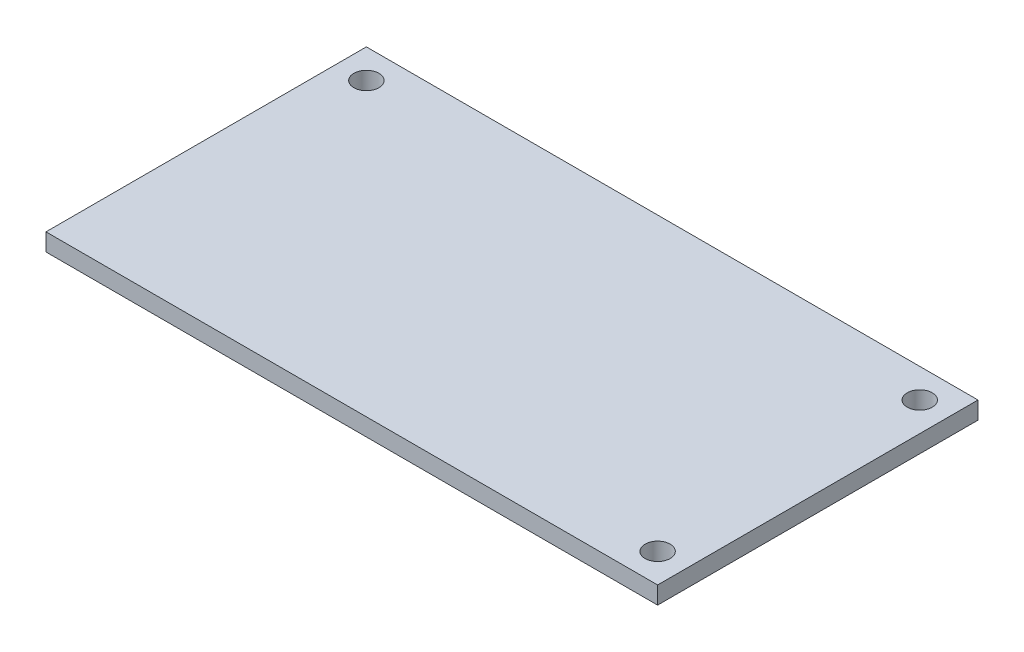
ISO-10303-21;
HEADER;
FILE_DESCRIPTION(('STEP AP214'),'2;1');
FILE_NAME('part.step','',(''),(''),'','','');
FILE_SCHEMA(('AUTOMOTIVE_DESIGN { 1 0 10303 214 1 1 1 1 }'));
ENDSEC;
DATA;
#1=APPLICATION_CONTEXT('core data for automotive mechanical design processes');
#2=APPLICATION_PROTOCOL_DEFINITION('international standard','automotive_design',2000,#1);
#3=PRODUCT_CONTEXT('',#1,'mechanical');
#4=PRODUCT('Part','Part','',(#3));
#5=PRODUCT_RELATED_PRODUCT_CATEGORY('part','',(#4));
#6=PRODUCT_DEFINITION_FORMATION('','',#4);
#7=PRODUCT_DEFINITION_CONTEXT('part definition',#1,'design');
#8=PRODUCT_DEFINITION('design','',#6,#7);
#9=PRODUCT_DEFINITION_SHAPE('','',#8);
#10=(LENGTH_UNIT() NAMED_UNIT(*) SI_UNIT(.MILLI.,.METRE.));
#11=(NAMED_UNIT(*) PLANE_ANGLE_UNIT() SI_UNIT($,.RADIAN.));
#12=(NAMED_UNIT(*) SI_UNIT($,.STERADIAN.) SOLID_ANGLE_UNIT());
#13=UNCERTAINTY_MEASURE_WITH_UNIT(LENGTH_MEASURE(1.E-05),#10,'distance_accuracy_value','');
#14=(GEOMETRIC_REPRESENTATION_CONTEXT(3) GLOBAL_UNCERTAINTY_ASSIGNED_CONTEXT((#13)) GLOBAL_UNIT_ASSIGNED_CONTEXT((#10,
#11,#12)) REPRESENTATION_CONTEXT('',''));
#15=CARTESIAN_POINT('',(0.,0.,0.));
#16=DIRECTION('',(0.,0.,1.));
#17=DIRECTION('',(1.,0.,0.));
#18=AXIS2_PLACEMENT_3D('',#15,#16,#17);
#19=CARTESIAN_POINT('',(0.,1.524,0.));
#20=DIRECTION('',(1.,0.,0.));
#21=DIRECTION('',(0.,0.,-1.));
#22=AXIS2_PLACEMENT_3D('',#19,#20,#21);
#23=PLANE('',#22);
#24=DIRECTION('',(0.,0.,1.));
#25=VECTOR('',#24,1.);
#26=CARTESIAN_POINT('',(0.,0.,0.));
#27=LINE('',#26,#25);
#28=CARTESIAN_POINT('',(0.,0.,-27.94));
#29=VERTEX_POINT('',#28);
#30=CARTESIAN_POINT('',(0.,0.,0.));
#31=VERTEX_POINT('',#30);
#32=EDGE_CURVE('E96',#29,#31,#27,.T.);
#33=ORIENTED_EDGE('',*,*,#32,.T.);
#34=DIRECTION('',(0.,-1.,0.));
#35=VECTOR('',#34,1.);
#36=CARTESIAN_POINT('',(0.,1.524,0.));
#37=LINE('',#36,#35);
#38=CARTESIAN_POINT('',(0.,1.524,0.));
#39=VERTEX_POINT('',#38);
#40=EDGE_CURVE('E11',#39,#31,#37,.T.);
#41=ORIENTED_EDGE('',*,*,#40,.F.);
#42=DIRECTION('',(0.,0.,1.));
#43=VECTOR('',#42,1.);
#44=CARTESIAN_POINT('',(0.,1.524,0.));
#45=LINE('',#44,#43);
#46=CARTESIAN_POINT('',(0.,1.524,-27.94));
#47=VERTEX_POINT('',#46);
#48=EDGE_CURVE('E84',#47,#39,#45,.T.);
#49=ORIENTED_EDGE('',*,*,#48,.F.);
#50=DIRECTION('',(0.,-1.,0.));
#51=VECTOR('',#50,1.);
#52=CARTESIAN_POINT('',(0.,1.524,-27.94));
#53=LINE('',#52,#51);
#54=EDGE_CURVE('E92',#47,#29,#53,.T.);
#55=ORIENTED_EDGE('',*,*,#54,.T.);
#56=EDGE_LOOP('',(#33,#41,#49,#55));
#57=FACE_BOUND('',#56,.T.);
#58=ADVANCED_FACE('F33',(#57),#23,.F.);
#59=CARTESIAN_POINT('',(0.,1.524,0.));
#60=DIRECTION('',(0.,0.,-1.));
#61=DIRECTION('',(-1.,0.,0.));
#62=AXIS2_PLACEMENT_3D('',#59,#60,#61);
#63=PLANE('',#62);
#64=DIRECTION('',(1.,0.,0.));
#65=VECTOR('',#64,1.);
#66=CARTESIAN_POINT('',(0.,0.,0.));
#67=LINE('',#66,#65);
#68=CARTESIAN_POINT('',(53.34,0.,0.));
#69=VERTEX_POINT('',#68);
#70=EDGE_CURVE('E88',#31,#69,#67,.T.);
#71=ORIENTED_EDGE('',*,*,#70,.T.);
#72=DIRECTION('',(0.,-1.,0.));
#73=VECTOR('',#72,1.);
#74=CARTESIAN_POINT('',(53.34,1.524,0.));
#75=LINE('',#74,#73);
#76=CARTESIAN_POINT('',(53.34,1.524,0.));
#77=VERTEX_POINT('',#76);
#78=EDGE_CURVE('E41',#77,#69,#75,.T.);
#79=ORIENTED_EDGE('',*,*,#78,.F.);
#80=DIRECTION('',(1.,0.,0.));
#81=VECTOR('',#80,1.);
#82=CARTESIAN_POINT('',(0.,1.524,0.));
#83=LINE('',#82,#81);
#84=EDGE_CURVE('E79',#39,#77,#83,.T.);
#85=ORIENTED_EDGE('',*,*,#84,.F.);
#86=ORIENTED_EDGE('',*,*,#40,.T.);
#87=EDGE_LOOP('',(#71,#79,#85,#86));
#88=FACE_BOUND('',#87,.T.);
#89=ADVANCED_FACE('F87',(#88),#63,.F.);
#90=CARTESIAN_POINT('',(53.34,1.524,0.));
#91=DIRECTION('',(-1.,0.,0.));
#92=DIRECTION('',(0.,0.,1.));
#93=AXIS2_PLACEMENT_3D('',#90,#91,#92);
#94=PLANE('',#93);
#95=DIRECTION('',(0.,0.,-1.));
#96=VECTOR('',#95,1.);
#97=CARTESIAN_POINT('',(53.34,0.,0.));
#98=LINE('',#97,#96);
#99=CARTESIAN_POINT('',(53.34,0.,-27.94));
#100=VERTEX_POINT('',#99);
#101=EDGE_CURVE('E66',#69,#100,#98,.T.);
#102=ORIENTED_EDGE('',*,*,#101,.T.);
#103=DIRECTION('',(0.,-1.,0.));
#104=VECTOR('',#103,1.);
#105=CARTESIAN_POINT('',(53.34,1.524,-27.94));
#106=LINE('',#105,#104);
#107=CARTESIAN_POINT('',(53.34,1.524,-27.94));
#108=VERTEX_POINT('',#107);
#109=EDGE_CURVE('E89',#108,#100,#106,.T.);
#110=ORIENTED_EDGE('',*,*,#109,.F.);
#111=DIRECTION('',(0.,0.,-1.));
#112=VECTOR('',#111,1.);
#113=CARTESIAN_POINT('',(53.34,1.524,0.));
#114=LINE('',#113,#112);
#115=EDGE_CURVE('E82',#77,#108,#114,.T.);
#116=ORIENTED_EDGE('',*,*,#115,.F.);
#117=ORIENTED_EDGE('',*,*,#78,.T.);
#118=EDGE_LOOP('',(#102,#110,#116,#117));
#119=FACE_BOUND('',#118,.T.);
#120=ADVANCED_FACE('F90',(#119),#94,.F.);
#121=CARTESIAN_POINT('',(0.,1.524,-27.94));
#122=DIRECTION('',(0.,0.,1.));
#123=DIRECTION('',(1.,0.,0.));
#124=AXIS2_PLACEMENT_3D('',#121,#122,#123);
#125=PLANE('',#124);
#126=DIRECTION('',(-1.,0.,0.));
#127=VECTOR('',#126,1.);
#128=CARTESIAN_POINT('',(0.,0.,-27.94));
#129=LINE('',#128,#127);
#130=EDGE_CURVE('E72',#100,#29,#129,.T.);
#131=ORIENTED_EDGE('',*,*,#130,.T.);
#132=ORIENTED_EDGE('',*,*,#54,.F.);
#133=DIRECTION('',(-1.,0.,0.));
#134=VECTOR('',#133,1.);
#135=CARTESIAN_POINT('',(0.,1.524,-27.94));
#136=LINE('',#135,#134);
#137=EDGE_CURVE('E49',#108,#47,#136,.T.);
#138=ORIENTED_EDGE('',*,*,#137,.F.);
#139=ORIENTED_EDGE('',*,*,#109,.T.);
#140=EDGE_LOOP('',(#131,#132,#138,#139));
#141=FACE_BOUND('',#140,.T.);
#142=ADVANCED_FACE('F104',(#141),#125,.F.);
#143=CARTESIAN_POINT('',(0.,1.524,0.));
#144=DIRECTION('',(0.,-1.,0.));
#145=DIRECTION('',(0.,0.,-1.));
#146=AXIS2_PLACEMENT_3D('',#143,#144,#145);
#147=PLANE('',#146);
#148=CARTESIAN_POINT('',(50.8,1.524,-2.54));
#149=DIRECTION('',(0.,1.,0.));
#150=DIRECTION('',(0.,0.,1.));
#151=AXIS2_PLACEMENT_3D('',#148,#149,#150);
#152=CIRCLE('',#151,1.0922);
#153=CARTESIAN_POINT('',(50.8,1.524,-1.44780000000001));
#154=VERTEX_POINT('',#153);
#155=EDGE_CURVE('E122',#154,#154,#152,.T.);
#156=ORIENTED_EDGE('',*,*,#155,.F.);
#157=EDGE_LOOP('',(#156));
#158=FACE_BOUND('',#157,.T.);
#159=CARTESIAN_POINT('',(50.8,1.524,-25.4));
#160=DIRECTION('',(0.,1.,0.));
#161=DIRECTION('',(0.,0.,1.));
#162=AXIS2_PLACEMENT_3D('',#159,#160,#161);
#163=CIRCLE('',#162,1.0922);
#164=CARTESIAN_POINT('',(50.8,1.524,-24.3078));
#165=VERTEX_POINT('',#164);
#166=EDGE_CURVE('E116',#165,#165,#163,.T.);
#167=ORIENTED_EDGE('',*,*,#166,.F.);
#168=EDGE_LOOP('',(#167));
#169=FACE_BOUND('',#168,.T.);
#170=CARTESIAN_POINT('',(2.54,1.524,-25.4));
#171=DIRECTION('',(0.,1.,0.));
#172=DIRECTION('',(0.,0.,1.));
#173=AXIS2_PLACEMENT_3D('',#170,#171,#172);
#174=CIRCLE('',#173,1.0922);
#175=CARTESIAN_POINT('',(2.54,1.524,-24.3078));
#176=VERTEX_POINT('',#175);
#177=EDGE_CURVE('E110',#176,#176,#174,.T.);
#178=ORIENTED_EDGE('',*,*,#177,.F.);
#179=EDGE_LOOP('',(#178));
#180=FACE_BOUND('',#179,.T.);
#181=ORIENTED_EDGE('',*,*,#48,.T.);
#182=ORIENTED_EDGE('',*,*,#84,.T.);
#183=ORIENTED_EDGE('',*,*,#115,.T.);
#184=ORIENTED_EDGE('',*,*,#137,.T.);
#185=EDGE_LOOP('',(#181,#182,#183,#184));
#186=FACE_BOUND('',#185,.T.);
#187=ADVANCED_FACE('F80',(#158,#169,#180,#186),#147,.F.);
#188=CARTESIAN_POINT('',(0.,0.,0.));
#189=DIRECTION('',(0.,-1.,0.));
#190=DIRECTION('',(0.,0.,-1.));
#191=AXIS2_PLACEMENT_3D('',#188,#189,#190);
#192=PLANE('',#191);
#193=CARTESIAN_POINT('',(50.8,0.,-2.54));
#194=DIRECTION('',(0.,1.,0.));
#195=DIRECTION('',(0.,0.,1.));
#196=AXIS2_PLACEMENT_3D('',#193,#194,#195);
#197=CIRCLE('',#196,1.0922);
#198=CARTESIAN_POINT('',(50.8,0.,-1.44780000000001));
#199=VERTEX_POINT('',#198);
#200=EDGE_CURVE('E119',#199,#199,#197,.T.);
#201=ORIENTED_EDGE('',*,*,#200,.T.);
#202=EDGE_LOOP('',(#201));
#203=FACE_BOUND('',#202,.T.);
#204=CARTESIAN_POINT('',(50.8,0.,-25.4));
#205=DIRECTION('',(0.,1.,0.));
#206=DIRECTION('',(0.,0.,1.));
#207=AXIS2_PLACEMENT_3D('',#204,#205,#206);
#208=CIRCLE('',#207,1.0922);
#209=CARTESIAN_POINT('',(50.8,0.,-24.3078));
#210=VERTEX_POINT('',#209);
#211=EDGE_CURVE('E113',#210,#210,#208,.T.);
#212=ORIENTED_EDGE('',*,*,#211,.T.);
#213=EDGE_LOOP('',(#212));
#214=FACE_BOUND('',#213,.T.);
#215=CARTESIAN_POINT('',(2.54,0.,-25.4));
#216=DIRECTION('',(0.,1.,0.));
#217=DIRECTION('',(0.,0.,1.));
#218=AXIS2_PLACEMENT_3D('',#215,#216,#217);
#219=CIRCLE('',#218,1.0922);
#220=CARTESIAN_POINT('',(2.54,0.,-24.3078));
#221=VERTEX_POINT('',#220);
#222=EDGE_CURVE('E99',#221,#221,#219,.T.);
#223=ORIENTED_EDGE('',*,*,#222,.T.);
#224=EDGE_LOOP('',(#223));
#225=FACE_BOUND('',#224,.T.);
#226=ORIENTED_EDGE('',*,*,#32,.F.);
#227=ORIENTED_EDGE('',*,*,#130,.F.);
#228=ORIENTED_EDGE('',*,*,#101,.F.);
#229=ORIENTED_EDGE('',*,*,#70,.F.);
#230=EDGE_LOOP('',(#226,#227,#228,#229));
#231=FACE_BOUND('',#230,.T.);
#232=ADVANCED_FACE('F107',(#203,#214,#225,#231),#192,.T.);
#233=CARTESIAN_POINT('',(2.54,0.,-25.4));
#234=DIRECTION('',(0.,1.,0.));
#235=DIRECTION('',(0.,0.,1.));
#236=AXIS2_PLACEMENT_3D('',#233,#234,#235);
#237=CYLINDRICAL_SURFACE('',#236,1.0922);
#238=CARTESIAN_POINT('',(2.54,0.,-24.3078));
#239=CARTESIAN_POINT('',(2.54,0.015875,-24.3078));
#240=CARTESIAN_POINT('',(2.54,0.03175,-24.3078));
#241=CARTESIAN_POINT('',(2.54,0.0635,-24.3078));
#242=CARTESIAN_POINT('',(2.54,0.079375,-24.3078));
#243=CARTESIAN_POINT('',(2.54,0.111125,-24.3078));
#244=CARTESIAN_POINT('',(2.54,0.127,-24.3078));
#245=CARTESIAN_POINT('',(2.54,0.15875,-24.3078));
#246=CARTESIAN_POINT('',(2.54,0.174625,-24.3078));
#247=CARTESIAN_POINT('',(2.54,0.206375,-24.3078));
#248=CARTESIAN_POINT('',(2.54,0.22225,-24.3078));
#249=CARTESIAN_POINT('',(2.54,0.254,-24.3078));
#250=CARTESIAN_POINT('',(2.54,0.269875,-24.3078));
#251=CARTESIAN_POINT('',(2.54,0.301625,-24.3078));
#252=CARTESIAN_POINT('',(2.54,0.3175,-24.3078));
#253=CARTESIAN_POINT('',(2.54,0.34925,-24.3078));
#254=CARTESIAN_POINT('',(2.54,0.365125,-24.3078));
#255=CARTESIAN_POINT('',(2.54,0.396875,-24.3078));
#256=CARTESIAN_POINT('',(2.54,0.41275,-24.3078));
#257=CARTESIAN_POINT('',(2.54,0.4445,-24.3078));
#258=CARTESIAN_POINT('',(2.54,0.460375,-24.3078));
#259=CARTESIAN_POINT('',(2.54,0.492125,-24.3078));
#260=CARTESIAN_POINT('',(2.54,0.508,-24.3078));
#261=CARTESIAN_POINT('',(2.54,0.53975,-24.3078));
#262=CARTESIAN_POINT('',(2.54,0.555625,-24.3078));
#263=CARTESIAN_POINT('',(2.54,0.587375,-24.3078));
#264=CARTESIAN_POINT('',(2.54,0.60325,-24.3078));
#265=CARTESIAN_POINT('',(2.54,0.635,-24.3078));
#266=CARTESIAN_POINT('',(2.54,0.650875,-24.3078));
#267=CARTESIAN_POINT('',(2.54,0.682625,-24.3078));
#268=CARTESIAN_POINT('',(2.54,0.6985,-24.3078));
#269=CARTESIAN_POINT('',(2.54,0.73025,-24.3078));
#270=CARTESIAN_POINT('',(2.54,0.746125,-24.3078));
#271=CARTESIAN_POINT('',(2.54,0.777875,-24.3078));
#272=CARTESIAN_POINT('',(2.54,0.79375,-24.3078));
#273=CARTESIAN_POINT('',(2.54,0.8255,-24.3078));
#274=CARTESIAN_POINT('',(2.54,0.841375,-24.3078));
#275=CARTESIAN_POINT('',(2.54,0.873125,-24.3078));
#276=CARTESIAN_POINT('',(2.54,0.889,-24.3078));
#277=CARTESIAN_POINT('',(2.54,0.92075,-24.3078));
#278=CARTESIAN_POINT('',(2.54,0.936625,-24.3078));
#279=CARTESIAN_POINT('',(2.54,0.968375,-24.3078));
#280=CARTESIAN_POINT('',(2.54,0.98425,-24.3078));
#281=CARTESIAN_POINT('',(2.54,1.016,-24.3078));
#282=CARTESIAN_POINT('',(2.54,1.031875,-24.3078));
#283=CARTESIAN_POINT('',(2.54,1.063625,-24.3078));
#284=CARTESIAN_POINT('',(2.54,1.0795,-24.3078));
#285=CARTESIAN_POINT('',(2.54,1.11125,-24.3078));
#286=CARTESIAN_POINT('',(2.54,1.127125,-24.3078));
#287=CARTESIAN_POINT('',(2.54,1.158875,-24.3078));
#288=CARTESIAN_POINT('',(2.54,1.17475,-24.3078));
#289=CARTESIAN_POINT('',(2.54,1.2065,-24.3078));
#290=CARTESIAN_POINT('',(2.54,1.222375,-24.3078));
#291=CARTESIAN_POINT('',(2.54,1.254125,-24.3078));
#292=CARTESIAN_POINT('',(2.54,1.27,-24.3078));
#293=CARTESIAN_POINT('',(2.54,1.30175,-24.3078));
#294=CARTESIAN_POINT('',(2.54,1.317625,-24.3078));
#295=CARTESIAN_POINT('',(2.54,1.349375,-24.3078));
#296=CARTESIAN_POINT('',(2.54,1.36525,-24.3078));
#297=CARTESIAN_POINT('',(2.54,1.397,-24.3078));
#298=CARTESIAN_POINT('',(2.54,1.412875,-24.3078));
#299=CARTESIAN_POINT('',(2.54,1.444625,-24.3078));
#300=CARTESIAN_POINT('',(2.54,1.4605,-24.3078));
#301=CARTESIAN_POINT('',(2.54,1.49225,-24.3078));
#302=CARTESIAN_POINT('',(2.54,1.508125,-24.3078));
#303=CARTESIAN_POINT('',(2.54,1.524,-24.3078));
#304=B_SPLINE_CURVE_WITH_KNOTS('',3,(#238,#239,#240,#241,#242,#243,#244,#245,#246,#247,#248,
#249,#250,#251,#252,#253,#254,#255,#256,#257,#258,#259,#260,#261,#262,#263,#264,#265,#266,#267,
#268,#269,#270,#271,#272,#273,#274,#275,#276,#277,#278,#279,#280,#281,#282,#283,#284,#285,#286,
#287,#288,#289,#290,#291,#292,#293,#294,#295,#296,#297,#298,#299,#300,#301,#302,#303),
.UNSPECIFIED.,.F.,.F.,(4,2,2,2,2,2,2,2,2,2,2,2,2,2,2,2,2,2,2,2,2,2,2,2,2,2,2,2,2,2,2,2,4),(0.,
0.047625,0.09525,0.142875,0.1905,0.238125,0.28575,0.333375,0.381,0.428625,0.47625,0.523875,
0.5715,0.619125,0.66675,0.714375,0.762,0.809625,0.85725,0.904875,0.9525,1.000125,1.04775,
1.095375,1.143,1.190625,1.23825,1.285875,1.3335,1.381125,1.42875,1.476375,1.524),.UNSPECIFIED.);
#305=EDGE_CURVE('BSEAM144',#221,#176,#304,.T.);
#306=ORIENTED_EDGE('',*,*,#222,.F.);
#307=ORIENTED_EDGE('',*,*,#177,.T.);
#308=ORIENTED_EDGE('',*,*,#305,.T.);
#309=ORIENTED_EDGE('',*,*,#305,.F.);
#310=EDGE_LOOP('',(#306,#308,#307,#309));
#311=FACE_BOUND('',#310,.T.);
#312=ADVANCED_FACE('F144',(#311),#237,.F.);
#313=CARTESIAN_POINT('',(50.8,0.,-25.4));
#314=DIRECTION('',(0.,1.,0.));
#315=DIRECTION('',(0.,0.,1.));
#316=AXIS2_PLACEMENT_3D('',#313,#314,#315);
#317=CYLINDRICAL_SURFACE('',#316,1.0922);
#318=CARTESIAN_POINT('',(50.8,0.,-24.3078));
#319=CARTESIAN_POINT('',(50.8,0.015875,-24.3078));
#320=CARTESIAN_POINT('',(50.8,0.03175,-24.3078));
#321=CARTESIAN_POINT('',(50.8,0.0635,-24.3078));
#322=CARTESIAN_POINT('',(50.8,0.079375,-24.3078));
#323=CARTESIAN_POINT('',(50.8,0.111125,-24.3078));
#324=CARTESIAN_POINT('',(50.8,0.127,-24.3078));
#325=CARTESIAN_POINT('',(50.8,0.15875,-24.3078));
#326=CARTESIAN_POINT('',(50.8,0.174625,-24.3078));
#327=CARTESIAN_POINT('',(50.8,0.206375,-24.3078));
#328=CARTESIAN_POINT('',(50.8,0.22225,-24.3078));
#329=CARTESIAN_POINT('',(50.8,0.254,-24.3078));
#330=CARTESIAN_POINT('',(50.8,0.269875,-24.3078));
#331=CARTESIAN_POINT('',(50.8,0.301625,-24.3078));
#332=CARTESIAN_POINT('',(50.8,0.3175,-24.3078));
#333=CARTESIAN_POINT('',(50.8,0.34925,-24.3078));
#334=CARTESIAN_POINT('',(50.8,0.365125,-24.3078));
#335=CARTESIAN_POINT('',(50.8,0.396875,-24.3078));
#336=CARTESIAN_POINT('',(50.8,0.41275,-24.3078));
#337=CARTESIAN_POINT('',(50.8,0.4445,-24.3078));
#338=CARTESIAN_POINT('',(50.8,0.460375,-24.3078));
#339=CARTESIAN_POINT('',(50.8,0.492125,-24.3078));
#340=CARTESIAN_POINT('',(50.8,0.508,-24.3078));
#341=CARTESIAN_POINT('',(50.8,0.53975,-24.3078));
#342=CARTESIAN_POINT('',(50.8,0.555625,-24.3078));
#343=CARTESIAN_POINT('',(50.8,0.587375,-24.3078));
#344=CARTESIAN_POINT('',(50.8,0.60325,-24.3078));
#345=CARTESIAN_POINT('',(50.8,0.635,-24.3078));
#346=CARTESIAN_POINT('',(50.8,0.650875,-24.3078));
#347=CARTESIAN_POINT('',(50.8,0.682625,-24.3078));
#348=CARTESIAN_POINT('',(50.8,0.6985,-24.3078));
#349=CARTESIAN_POINT('',(50.8,0.73025,-24.3078));
#350=CARTESIAN_POINT('',(50.8,0.746125,-24.3078));
#351=CARTESIAN_POINT('',(50.8,0.777875,-24.3078));
#352=CARTESIAN_POINT('',(50.8,0.79375,-24.3078));
#353=CARTESIAN_POINT('',(50.8,0.8255,-24.3078));
#354=CARTESIAN_POINT('',(50.8,0.841375,-24.3078));
#355=CARTESIAN_POINT('',(50.8,0.873125,-24.3078));
#356=CARTESIAN_POINT('',(50.8,0.889,-24.3078));
#357=CARTESIAN_POINT('',(50.8,0.92075,-24.3078));
#358=CARTESIAN_POINT('',(50.8,0.936625,-24.3078));
#359=CARTESIAN_POINT('',(50.8,0.968375,-24.3078));
#360=CARTESIAN_POINT('',(50.8,0.98425,-24.3078));
#361=CARTESIAN_POINT('',(50.8,1.016,-24.3078));
#362=CARTESIAN_POINT('',(50.8,1.031875,-24.3078));
#363=CARTESIAN_POINT('',(50.8,1.063625,-24.3078));
#364=CARTESIAN_POINT('',(50.8,1.0795,-24.3078));
#365=CARTESIAN_POINT('',(50.8,1.11125,-24.3078));
#366=CARTESIAN_POINT('',(50.8,1.127125,-24.3078));
#367=CARTESIAN_POINT('',(50.8,1.158875,-24.3078));
#368=CARTESIAN_POINT('',(50.8,1.17475,-24.3078));
#369=CARTESIAN_POINT('',(50.8,1.2065,-24.3078));
#370=CARTESIAN_POINT('',(50.8,1.222375,-24.3078));
#371=CARTESIAN_POINT('',(50.8,1.254125,-24.3078));
#372=CARTESIAN_POINT('',(50.8,1.27,-24.3078));
#373=CARTESIAN_POINT('',(50.8,1.30175,-24.3078));
#374=CARTESIAN_POINT('',(50.8,1.317625,-24.3078));
#375=CARTESIAN_POINT('',(50.8,1.349375,-24.3078));
#376=CARTESIAN_POINT('',(50.8,1.36525,-24.3078));
#377=CARTESIAN_POINT('',(50.8,1.397,-24.3078));
#378=CARTESIAN_POINT('',(50.8,1.412875,-24.3078));
#379=CARTESIAN_POINT('',(50.8,1.444625,-24.3078));
#380=CARTESIAN_POINT('',(50.8,1.4605,-24.3078));
#381=CARTESIAN_POINT('',(50.8,1.49225,-24.3078));
#382=CARTESIAN_POINT('',(50.8,1.508125,-24.3078));
#383=CARTESIAN_POINT('',(50.8,1.524,-24.3078));
#384=B_SPLINE_CURVE_WITH_KNOTS('',3,(#318,#319,#320,#321,#322,#323,#324,#325,#326,#327,#328,
#329,#330,#331,#332,#333,#334,#335,#336,#337,#338,#339,#340,#341,#342,#343,#344,#345,#346,#347,
#348,#349,#350,#351,#352,#353,#354,#355,#356,#357,#358,#359,#360,#361,#362,#363,#364,#365,#366,
#367,#368,#369,#370,#371,#372,#373,#374,#375,#376,#377,#378,#379,#380,#381,#382,#383),
.UNSPECIFIED.,.F.,.F.,(4,2,2,2,2,2,2,2,2,2,2,2,2,2,2,2,2,2,2,2,2,2,2,2,2,2,2,2,2,2,2,2,4),(0.,
0.047625,0.09525,0.142875,0.1905,0.238125,0.28575,0.333375,0.381,0.428625,0.47625,0.523875,
0.5715,0.619125,0.66675,0.714375,0.762,0.809625,0.85725,0.904875,0.9525,1.000125,1.04775,
1.095375,1.143,1.190625,1.23825,1.285875,1.3335,1.381125,1.42875,1.476375,1.524),.UNSPECIFIED.);
#385=EDGE_CURVE('BSEAM133',#210,#165,#384,.T.);
#386=ORIENTED_EDGE('',*,*,#211,.F.);
#387=ORIENTED_EDGE('',*,*,#166,.T.);
#388=ORIENTED_EDGE('',*,*,#385,.T.);
#389=ORIENTED_EDGE('',*,*,#385,.F.);
#390=EDGE_LOOP('',(#386,#388,#387,#389));
#391=FACE_BOUND('',#390,.T.);
#392=ADVANCED_FACE('F133',(#391),#317,.F.);
#393=CARTESIAN_POINT('',(50.8,0.,-2.54));
#394=DIRECTION('',(0.,1.,0.));
#395=DIRECTION('',(0.,0.,1.));
#396=AXIS2_PLACEMENT_3D('',#393,#394,#395);
#397=CYLINDRICAL_SURFACE('',#396,1.0922);
#398=CARTESIAN_POINT('',(50.8,0.,-1.44780000000001));
#399=CARTESIAN_POINT('',(50.8,0.015875,-1.44780000000001));
#400=CARTESIAN_POINT('',(50.8,0.03175,-1.44780000000001));
#401=CARTESIAN_POINT('',(50.8,0.0635,-1.44780000000001));
#402=CARTESIAN_POINT('',(50.8,0.079375,-1.44780000000001));
#403=CARTESIAN_POINT('',(50.8,0.111125,-1.44780000000001));
#404=CARTESIAN_POINT('',(50.8,0.127,-1.44780000000001));
#405=CARTESIAN_POINT('',(50.8,0.15875,-1.44780000000001));
#406=CARTESIAN_POINT('',(50.8,0.174625,-1.44780000000001));
#407=CARTESIAN_POINT('',(50.8,0.206375,-1.44780000000001));
#408=CARTESIAN_POINT('',(50.8,0.22225,-1.44780000000001));
#409=CARTESIAN_POINT('',(50.8,0.254,-1.44780000000001));
#410=CARTESIAN_POINT('',(50.8,0.269875,-1.44780000000001));
#411=CARTESIAN_POINT('',(50.8,0.301625,-1.44780000000001));
#412=CARTESIAN_POINT('',(50.8,0.3175,-1.44780000000001));
#413=CARTESIAN_POINT('',(50.8,0.34925,-1.44780000000001));
#414=CARTESIAN_POINT('',(50.8,0.365125,-1.44780000000001));
#415=CARTESIAN_POINT('',(50.8,0.396875,-1.44780000000001));
#416=CARTESIAN_POINT('',(50.8,0.41275,-1.44780000000001));
#417=CARTESIAN_POINT('',(50.8,0.4445,-1.44780000000001));
#418=CARTESIAN_POINT('',(50.8,0.460375,-1.44780000000001));
#419=CARTESIAN_POINT('',(50.8,0.492125,-1.44780000000001));
#420=CARTESIAN_POINT('',(50.8,0.508,-1.44780000000001));
#421=CARTESIAN_POINT('',(50.8,0.53975,-1.44780000000001));
#422=CARTESIAN_POINT('',(50.8,0.555625,-1.44780000000001));
#423=CARTESIAN_POINT('',(50.8,0.587375,-1.44780000000001));
#424=CARTESIAN_POINT('',(50.8,0.60325,-1.44780000000001));
#425=CARTESIAN_POINT('',(50.8,0.635,-1.44780000000001));
#426=CARTESIAN_POINT('',(50.8,0.650875,-1.44780000000001));
#427=CARTESIAN_POINT('',(50.8,0.682625,-1.44780000000001));
#428=CARTESIAN_POINT('',(50.8,0.6985,-1.44780000000001));
#429=CARTESIAN_POINT('',(50.8,0.73025,-1.44780000000001));
#430=CARTESIAN_POINT('',(50.8,0.746125,-1.44780000000001));
#431=CARTESIAN_POINT('',(50.8,0.777875,-1.44780000000001));
#432=CARTESIAN_POINT('',(50.8,0.79375,-1.44780000000001));
#433=CARTESIAN_POINT('',(50.8,0.8255,-1.44780000000001));
#434=CARTESIAN_POINT('',(50.8,0.841375,-1.44780000000001));
#435=CARTESIAN_POINT('',(50.8,0.873125,-1.44780000000001));
#436=CARTESIAN_POINT('',(50.8,0.889,-1.44780000000001));
#437=CARTESIAN_POINT('',(50.8,0.92075,-1.44780000000001));
#438=CARTESIAN_POINT('',(50.8,0.936625,-1.44780000000001));
#439=CARTESIAN_POINT('',(50.8,0.968375,-1.44780000000001));
#440=CARTESIAN_POINT('',(50.8,0.98425,-1.44780000000001));
#441=CARTESIAN_POINT('',(50.8,1.016,-1.44780000000001));
#442=CARTESIAN_POINT('',(50.8,1.031875,-1.44780000000001));
#443=CARTESIAN_POINT('',(50.8,1.063625,-1.44780000000001));
#444=CARTESIAN_POINT('',(50.8,1.0795,-1.44780000000001));
#445=CARTESIAN_POINT('',(50.8,1.11125,-1.44780000000001));
#446=CARTESIAN_POINT('',(50.8,1.127125,-1.44780000000001));
#447=CARTESIAN_POINT('',(50.8,1.158875,-1.44780000000001));
#448=CARTESIAN_POINT('',(50.8,1.17475,-1.44780000000001));
#449=CARTESIAN_POINT('',(50.8,1.2065,-1.44780000000001));
#450=CARTESIAN_POINT('',(50.8,1.222375,-1.44780000000001));
#451=CARTESIAN_POINT('',(50.8,1.254125,-1.44780000000001));
#452=CARTESIAN_POINT('',(50.8,1.27,-1.44780000000001));
#453=CARTESIAN_POINT('',(50.8,1.30175,-1.44780000000001));
#454=CARTESIAN_POINT('',(50.8,1.317625,-1.44780000000001));
#455=CARTESIAN_POINT('',(50.8,1.349375,-1.44780000000001));
#456=CARTESIAN_POINT('',(50.8,1.36525,-1.44780000000001));
#457=CARTESIAN_POINT('',(50.8,1.397,-1.44780000000001));
#458=CARTESIAN_POINT('',(50.8,1.412875,-1.44780000000001));
#459=CARTESIAN_POINT('',(50.8,1.444625,-1.44780000000001));
#460=CARTESIAN_POINT('',(50.8,1.4605,-1.44780000000001));
#461=CARTESIAN_POINT('',(50.8,1.49225,-1.44780000000001));
#462=CARTESIAN_POINT('',(50.8,1.508125,-1.44780000000001));
#463=CARTESIAN_POINT('',(50.8,1.524,-1.44780000000001));
#464=B_SPLINE_CURVE_WITH_KNOTS('',3,(#398,#399,#400,#401,#402,#403,#404,#405,#406,#407,#408,
#409,#410,#411,#412,#413,#414,#415,#416,#417,#418,#419,#420,#421,#422,#423,#424,#425,#426,#427,
#428,#429,#430,#431,#432,#433,#434,#435,#436,#437,#438,#439,#440,#441,#442,#443,#444,#445,#446,
#447,#448,#449,#450,#451,#452,#453,#454,#455,#456,#457,#458,#459,#460,#461,#462,#463),
.UNSPECIFIED.,.F.,.F.,(4,2,2,2,2,2,2,2,2,2,2,2,2,2,2,2,2,2,2,2,2,2,2,2,2,2,2,2,2,2,2,2,4),(0.,
0.047625,0.09525,0.142875,0.1905,0.238125,0.28575,0.333375,0.381,0.428625,0.47625,0.523875,
0.5715,0.619125,0.66675,0.714375,0.762,0.809625,0.85725,0.904875,0.9525,1.000125,1.04775,
1.095375,1.143,1.190625,1.23825,1.285875,1.3335,1.381125,1.42875,1.476375,1.524),.UNSPECIFIED.);
#465=EDGE_CURVE('BSEAM130',#199,#154,#464,.T.);
#466=ORIENTED_EDGE('',*,*,#200,.F.);
#467=ORIENTED_EDGE('',*,*,#155,.T.);
#468=ORIENTED_EDGE('',*,*,#465,.T.);
#469=ORIENTED_EDGE('',*,*,#465,.F.);
#470=EDGE_LOOP('',(#466,#468,#467,#469));
#471=FACE_BOUND('',#470,.T.);
#472=ADVANCED_FACE('F130',(#471),#397,.F.);
#473=CLOSED_SHELL('',(#58,#89,#120,#142,#187,#232,#312,#392,#472));
#474=MANIFOLD_SOLID_BREP('B2',#473);
#475=ADVANCED_BREP_SHAPE_REPRESENTATION('',(#18,#474),#14);
#476=SHAPE_DEFINITION_REPRESENTATION(#9,#475);
ENDSEC;
END-ISO-10303-21;
